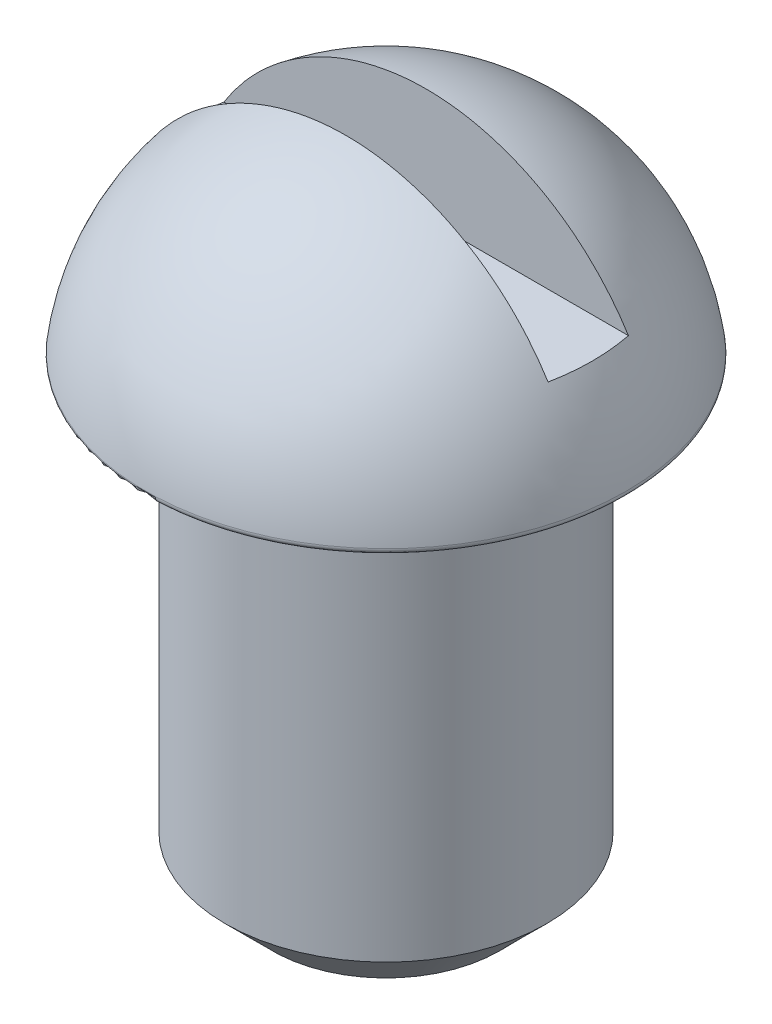
ISO-10303-21;
HEADER;
FILE_DESCRIPTION(('STEP AP214'),'2;1');
FILE_NAME('part.step','',(''),(''),'','','');
FILE_SCHEMA(('AUTOMOTIVE_DESIGN { 1 0 10303 214 1 1 1 1 }'));
ENDSEC;
DATA;
#1=APPLICATION_CONTEXT('core data for automotive mechanical design processes');
#2=APPLICATION_PROTOCOL_DEFINITION('international standard','automotive_design',2000,#1);
#3=PRODUCT_CONTEXT('',#1,'mechanical');
#4=PRODUCT('Part','Part','',(#3));
#5=PRODUCT_RELATED_PRODUCT_CATEGORY('part','',(#4));
#6=PRODUCT_DEFINITION_FORMATION('','',#4);
#7=PRODUCT_DEFINITION_CONTEXT('part definition',#1,'design');
#8=PRODUCT_DEFINITION('design','',#6,#7);
#9=PRODUCT_DEFINITION_SHAPE('','',#8);
#10=(LENGTH_UNIT() NAMED_UNIT(*) SI_UNIT(.MILLI.,.METRE.));
#11=(NAMED_UNIT(*) PLANE_ANGLE_UNIT() SI_UNIT($,.RADIAN.));
#12=(NAMED_UNIT(*) SI_UNIT($,.STERADIAN.) SOLID_ANGLE_UNIT());
#13=UNCERTAINTY_MEASURE_WITH_UNIT(LENGTH_MEASURE(1.E-05),#10,'distance_accuracy_value','');
#14=(GEOMETRIC_REPRESENTATION_CONTEXT(3) GLOBAL_UNCERTAINTY_ASSIGNED_CONTEXT((#13)) GLOBAL_UNIT_ASSIGNED_CONTEXT((#10,
#11,#12)) REPRESENTATION_CONTEXT('',''));
#15=CARTESIAN_POINT('',(0.,0.,0.));
#16=DIRECTION('',(0.,0.,1.));
#17=DIRECTION('',(1.,0.,0.));
#18=AXIS2_PLACEMENT_3D('',#15,#16,#17);
#19=CARTESIAN_POINT('',(0.,85.2820214748699,0.));
#20=DIRECTION('',(0.,1.,0.));
#21=DIRECTION('',(-1.,0.,0.));
#22=AXIS2_PLACEMENT_3D('',#19,#20,#21);
#23=DEGENERATE_TOROIDAL_SURFACE('',#22,0.0484444428070954,9.1,.F.);
#24=CARTESIAN_POINT('',(0.,86.4755444133753,0.));
#25=DIRECTION('',(0.,-1.,0.));
#26=DIRECTION('',(1.,0.,0.));
#27=AXIS2_PLACEMENT_3D('',#24,#25,#26);
#28=CIRCLE('',#27,8.97294696845876);
#29=CARTESIAN_POINT('',(8.97294696845875,86.4755444133753,0.));
#30=VERTEX_POINT('',#29);
#31=EDGE_CURVE('E109',#30,#30,#28,.F.);
#32=ORIENTED_EDGE('',*,*,#31,.T.);
#33=EDGE_LOOP('',(#32));
#34=FACE_BOUND('',#33,.T.);
#35=CARTESIAN_POINT('',(0.,90.0493131400015,0.));
#36=DIRECTION('',(0.,1.,0.));
#37=DIRECTION('',(0.,0.,1.));
#38=AXIS2_PLACEMENT_3D('',#35,#36,#37);
#39=CIRCLE('',#38,7.70287352122754);
#40=CARTESIAN_POINT('',(7.555412661399,90.0493131400015,1.5));
#41=VERTEX_POINT('',#40);
#42=CARTESIAN_POINT('',(7.555412661399,90.0493131400015,-1.5));
#43=VERTEX_POINT('',#42);
#44=EDGE_CURVE('E59',#41,#43,#39,.T.);
#45=ORIENTED_EDGE('',*,*,#44,.F.);
#46=CARTESIAN_POINT('',(0.,94.2493131400015,1.5));
#47=CARTESIAN_POINT('',(-0.253126286000892,94.2493147584084,1.5));
#48=CARTESIAN_POINT('',(-0.506239797947491,94.2382230550661,1.5));
#49=CARTESIAN_POINT('',(-1.01053156617786,94.1941887869828,1.5));
#50=CARTESIAN_POINT('',(-1.26171000869937,94.1612483523017,1.5));
#51=CARTESIAN_POINT('',(-1.75779628974337,94.0744780129281,1.5));
#52=CARTESIAN_POINT('',(-2.0027418927103,94.0208634352023,1.5));
#53=CARTESIAN_POINT('',(-2.48734232888324,93.8932037480559,1.5));
#54=CARTESIAN_POINT('',(-2.72699524952156,93.8191513795855,1.5));
#55=CARTESIAN_POINT('',(-3.19958344197064,93.6510764324646,1.5));
#56=CARTESIAN_POINT('',(-3.43250846779259,93.5570250486329,1.5));
#57=CARTESIAN_POINT('',(-3.88964612829137,93.3497019205855,1.5));
#58=CARTESIAN_POINT('',(-4.11385860041981,93.2364298179841,1.5));
#59=CARTESIAN_POINT('',(-4.55228637520147,92.9913120123662,1.5));
#60=CARTESIAN_POINT('',(-4.76648781822825,92.8594415192794,1.5));
#61=CARTESIAN_POINT('',(-5.18306604276846,92.5781770699538,1.5));
#62=CARTESIAN_POINT('',(-5.38544254899095,92.4287827059931,1.5));
#63=CARTESIAN_POINT('',(-5.77683207995016,92.113617752993,1.5));
#64=CARTESIAN_POINT('',(-5.96585234812945,91.947856159113,1.5));
#65=CARTESIAN_POINT('',(-6.32938279182137,91.6009996747844,1.5));
#66=CARTESIAN_POINT('',(-6.50388792222596,91.4198994967939,1.5));
#67=CARTESIAN_POINT('',(-6.83767545333952,91.0430277660081,1.5));
#68=CARTESIAN_POINT('',(-6.99690179921901,90.8472065626681,1.5));
#69=CARTESIAN_POINT('',(-7.29830176686525,90.4428483493586,1.5));
#70=CARTESIAN_POINT('',(-7.44047509577037,90.234311121102,1.5));
#71=CARTESIAN_POINT('',(-7.70676482887685,89.805992817466,1.5));
#72=CARTESIAN_POINT('',(-7.83088016138328,89.5862110757996,1.5));
#73=CARTESIAN_POINT('',(-8.0601651632223,89.1369719279644,1.5));
#74=CARTESIAN_POINT('',(-8.16533442308827,88.9075143128108,1.5));
#75=CARTESIAN_POINT('',(-8.35599434334159,88.4405163920357,1.5));
#76=CARTESIAN_POINT('',(-8.44148149285895,88.202974653039,1.5));
#77=CARTESIAN_POINT('',(-8.59217213345419,87.721451811669,1.5));
#78=CARTESIAN_POINT('',(-8.65736858514219,87.4774685063175,1.5));
#79=CARTESIAN_POINT('',(-8.76696416438945,86.9849219070482,1.5));
#80=CARTESIAN_POINT('',(-8.81136711221042,86.7363594631559,1.5));
#81=CARTESIAN_POINT('',(-8.87907800268428,86.2363774056246,1.5));
#82=CARTESIAN_POINT('',(-8.90238591768649,85.9849577882409,1.5));
#83=CARTESIAN_POINT('',(-8.92774204044019,85.4810288473107,1.5));
#84=CARTESIAN_POINT('',(-8.92978856712383,85.2285194391769,1.5));
#85=CARTESIAN_POINT('',(-8.91260276802194,84.72421883529,1.5));
#86=CARTESIAN_POINT('',(-8.89336985759334,84.4724276594607,1.5));
#87=CARTESIAN_POINT('',(-8.83376082500649,83.9713597519565,1.5));
#88=CARTESIAN_POINT('',(-8.7933846336998,83.7220830285079,1.5));
#89=CARTESIAN_POINT('',(-8.69177731884776,83.2278238992692,1.5));
#90=CARTESIAN_POINT('',(-8.63054676692235,82.9828413759681,1.5));
#91=CARTESIAN_POINT('',(-8.48766363074804,82.4988987489693,1.5));
#92=CARTESIAN_POINT('',(-8.40601049346716,82.2599388085525,1.5));
#93=CARTESIAN_POINT('',(-8.22286338640708,81.7897476197453,1.5));
#94=CARTESIAN_POINT('',(-8.12136944257431,81.5585163612482,1.5));
#95=CARTESIAN_POINT('',(-7.89924332215015,81.1053886367319,1.5));
#96=CARTESIAN_POINT('',(-7.77860796094373,80.8834937318157,1.5));
#97=CARTESIAN_POINT('',(-7.51911368947463,80.4507332794758,1.5));
#98=CARTESIAN_POINT('',(-7.38026110771471,80.2398639372828,1.5));
#99=CARTESIAN_POINT('',(-7.08526643753657,79.8305437482489,1.5));
#100=CARTESIAN_POINT('',(-6.92912202534685,79.6320945761211,1.5));
#101=CARTESIAN_POINT('',(-6.60067215441629,79.2490621046702,1.5));
#102=CARTESIAN_POINT('',(-6.42836707588407,79.0644784793191,1.5));
#103=CARTESIAN_POINT('',(-6.06881176708733,78.7104808605171,1.5));
#104=CARTESIAN_POINT('',(-5.88156111937584,78.5410672910641,1.5));
#105=CARTESIAN_POINT('',(-5.49345219243313,78.2186252818443,1.5));
#106=CARTESIAN_POINT('',(-5.29259413258583,78.065596578017,1.5));
#107=CARTESIAN_POINT('',(-4.87870508402365,77.77702085446,1.5));
#108=CARTESIAN_POINT('',(-4.66567472990684,77.6414729245744,1.5));
#109=CARTESIAN_POINT('',(-4.22902536669204,77.3888669372677,1.5));
#110=CARTESIAN_POINT('',(-4.00541031394046,77.2718020410988,1.5));
#111=CARTESIAN_POINT('',(-3.54904618870066,77.0569180273546,1.5));
#112=CARTESIAN_POINT('',(-3.31629479204677,76.9591038454653,1.5));
#113=CARTESIAN_POINT('',(-2.84335871664583,76.7834755195159,1.5));
#114=CARTESIAN_POINT('',(-2.60317389747381,76.7056617535429,1.5));
#115=CARTESIAN_POINT('',(-2.11731034774447,76.5707029511665,1.5));
#116=CARTESIAN_POINT('',(-1.87163705721269,76.5135383357546,1.5));
#117=CARTESIAN_POINT('',(-1.37632314360723,76.4202865837127,1.5));
#118=CARTESIAN_POINT('',(-1.12668260809043,76.384198982576,1.5));
#119=CARTESIAN_POINT('',(-0.625279946721241,76.3336108528795,1.5));
#120=CARTESIAN_POINT('',(-0.37351838828146,76.3191047244346,1.5));
#121=CARTESIAN_POINT('',(0.130308789582986,76.3120572213891,1.5));
#122=CARTESIAN_POINT('',(0.382374400592746,76.3195152522488,1.5));
#123=CARTESIAN_POINT('',(0.880193058063184,76.355820738571,1.5));
#124=CARTESIAN_POINT('',(1.12597582062862,76.3842643295761,1.5));
#125=CARTESIAN_POINT('',(1.61430623343127,76.4615924922849,1.5));
#126=CARTESIAN_POINT('',(1.85685379826309,76.5104776025227,1.5));
#127=CARTESIAN_POINT('',(2.337113652077,76.6282378915395,1.5));
#128=CARTESIAN_POINT('',(2.57482461934085,76.6971184580916,1.5));
#129=CARTESIAN_POINT('',(3.04371937841491,76.8543307356359,1.5));
#130=CARTESIAN_POINT('',(3.27490326197323,76.9426621730626,1.5));
#131=CARTESIAN_POINT('',(3.73162277345527,77.1392000179846,1.5));
#132=CARTESIAN_POINT('',(3.95707063824226,77.2476104287428,1.5));
#133=CARTESIAN_POINT('',(4.3982008895612,77.4829306336545,1.5));
#134=CARTESIAN_POINT('',(4.61387965832145,77.6098472089269,1.5));
#135=CARTESIAN_POINT('',(5.03381428513797,77.8812130744994,1.5));
#136=CARTESIAN_POINT('',(5.23807369705332,78.0256568652222,1.5));
#137=CARTESIAN_POINT('',(5.63382166983986,78.3310979364636,1.5));
#138=CARTESIAN_POINT('',(5.82530998310113,78.4920955377787,1.5));
#139=CARTESIAN_POINT('',(6.1957347380034,78.8309411930151,1.5));
#140=CARTESIAN_POINT('',(6.37455159586909,79.008920001311,1.5));
#141=CARTESIAN_POINT('',(6.71657236025573,79.3793043085305,1.5));
#142=CARTESIAN_POINT('',(6.87977580325888,79.5717102354518,1.5));
#143=CARTESIAN_POINT('',(7.18938961811549,79.969555622385,1.5));
#144=CARTESIAN_POINT('',(7.33580184758958,80.1749936367372,1.5));
#145=CARTESIAN_POINT('',(7.61086340476026,80.5975369595277,1.5));
#146=CARTESIAN_POINT('',(7.73950655833195,80.8146462871153,1.5));
#147=CARTESIAN_POINT('',(7.97811476805929,81.259032481617,1.5));
#148=CARTESIAN_POINT('',(8.08807075860098,81.486314216261,1.5));
#149=CARTESIAN_POINT('',(8.28844979128575,81.9493366296918,1.5));
#150=CARTESIAN_POINT('',(8.3788724183493,82.1850774881089,1.5));
#151=CARTESIAN_POINT('',(8.53953605434811,82.6633278561975,1.5));
#152=CARTESIAN_POINT('',(8.60977790926667,82.9058370816695,1.5));
#153=CARTESIAN_POINT('',(8.72958735360661,83.3959151803932,1.5));
#154=CARTESIAN_POINT('',(8.77915451173507,83.643484159083,1.5));
#155=CARTESIAN_POINT('',(8.85726568176,84.1419514880077,1.5));
#156=CARTESIAN_POINT('',(8.88580681453034,84.3928502894137,1.5));
#157=CARTESIAN_POINT('',(8.92165201319401,84.8961603771749,1.5));
#158=CARTESIAN_POINT('',(8.92895607771604,85.1485716636278,1.5));
#159=CARTESIAN_POINT('',(8.92227518547556,85.6531161497072,1.5));
#160=CARTESIAN_POINT('',(8.90828990798377,85.9052493450871,1.5));
#161=CARTESIAN_POINT('',(8.85912963685118,86.4074361105604,1.5));
#162=CARTESIAN_POINT('',(8.82395508654758,86.6574897240534,1.5));
#163=CARTESIAN_POINT('',(8.73266497920622,87.1537537415015,1.5));
#164=CARTESIAN_POINT('',(8.67654869038963,87.3999640108433,1.5));
#165=CARTESIAN_POINT('',(8.54377541474271,87.886776779083,1.5));
#166=CARTESIAN_POINT('',(8.46711885819499,88.1273793953366,1.5));
#167=CARTESIAN_POINT('',(8.29379103479565,88.6013212640006,1.5));
#168=CARTESIAN_POINT('',(8.19711558242708,88.8346589857242,1.5));
#169=CARTESIAN_POINT('',(7.98448385475258,89.2922792318004,1.5));
#170=CARTESIAN_POINT('',(7.86853426441638,89.5165648623429,1.5));
#171=CARTESIAN_POINT('',(7.61812553398023,89.9546225479832,1.5));
#172=CARTESIAN_POINT('',(7.48366213244255,90.1683921671258,1.5));
#173=CARTESIAN_POINT('',(7.19720487809234,90.5838371322688,1.5));
#174=CARTESIAN_POINT('',(7.04521140855555,90.7855127425449,1.5));
#175=CARTESIAN_POINT('',(6.72479675918272,91.1753093235742,1.5));
#176=CARTESIAN_POINT('',(6.55637814810753,91.3634324058586,1.5));
#177=CARTESIAN_POINT('',(6.20429252451751,91.724816955788,1.5));
#178=CARTESIAN_POINT('',(6.02062575567433,91.8980786608338,1.5));
#179=CARTESIAN_POINT('',(5.63940331432423,92.2284601174589,1.5));
#180=CARTESIAN_POINT('',(5.44185184138895,92.3855847147849,1.5));
#181=CARTESIAN_POINT('',(5.03428351401001,92.6825804589461,1.5));
#182=CARTESIAN_POINT('',(4.82427094214995,92.8224574830713,1.5));
#183=CARTESIAN_POINT('',(4.39298629491286,93.0841555867799,1.5));
#184=CARTESIAN_POINT('',(4.17170295895762,93.2059581132855,1.5));
#185=CARTESIAN_POINT('',(3.71964464380099,93.4304619076131,1.5));
#186=CARTESIAN_POINT('',(3.48886922823869,93.5331622960885,1.5));
#187=CARTESIAN_POINT('',(2.99560575533823,93.7281363020401,1.5));
#188=CARTESIAN_POINT('',(2.73227728228447,93.8182916751928,1.5));
#189=CARTESIAN_POINT('',(2.19836471618549,93.9736639898798,1.5));
#190=CARTESIAN_POINT('',(1.92778051845821,94.0388805714022,1.5));
#191=CARTESIAN_POINT('',(1.3821745433772,94.1435949892502,1.5));
#192=CARTESIAN_POINT('',(1.10716153976396,94.1831384810188,1.5));
#193=CARTESIAN_POINT('',(0.554759633465017,94.2359893297277,1.5));
#194=CARTESIAN_POINT('',(0.277372147534231,94.2493113665745,1.5));
#195=CARTESIAN_POINT('',(0.,94.2493131400015,1.5));
#196=B_SPLINE_CURVE_WITH_KNOTS('',3,(#46,#47,#48,#49,#50,#51,#52,#53,#54,#55,#56,#57,#58,#59,
#60,#61,#62,#63,#64,#65,#66,#67,#68,#69,#70,#71,#72,#73,#74,#75,#76,#77,#78,#79,#80,#81,#82,#83,
#84,#85,#86,#87,#88,#89,#90,#91,#92,#93,#94,#95,#96,#97,#98,#99,#100,#101,#102,#103,#104,#105,
#106,#107,#108,#109,#110,#111,#112,#113,#114,#115,#116,#117,#118,#119,#120,#121,#122,#123,#124,
#125,#126,#127,#128,#129,#130,#131,#132,#133,#134,#135,#136,#137,#138,#139,#140,#141,#142,#143,
#144,#145,#146,#147,#148,#149,#150,#151,#152,#153,#154,#155,#156,#157,#158,#159,#160,#161,#162,
#163,#164,#165,#166,#167,#168,#169,#170,#171,#172,#173,#174,#175,#176,#177,#178,#179,#180,#181,
#182,#183,#184,#185,#186,#187,#188,#189,#190,#191,#192,#193,#194,#195),.UNSPECIFIED.,.T.,.F.,(4,
2,2,2,2,2,2,2,2,2,2,2,2,2,2,2,2,2,2,2,2,2,2,2,2,2,2,2,2,2,2,2,2,2,2,2,2,2,2,2,2,2,2,2,2,2,2,2,2,
2,2,2,2,2,2,2,2,2,2,2,2,2,2,2,2,2,2,2,2,2,2,2,2,2,4),(0.,0.759120308470634,1.51816662023554,
2.26951194837326,3.0211244818922,3.77382700849304,4.52654357138102,5.28027309386196,
6.03402015658892,6.7873552539812,7.54095110756811,8.29721375353569,9.05348938539379,
9.80980988194432,10.5661467222973,11.3226183727134,12.0793521717353,12.8359468861443,
13.5925425922716,14.3491981194708,15.1058744359607,15.8625532271527,16.6192112793784,
17.3758898236925,18.132567378482,18.8893709562426,19.645912319783,20.4025554751791,
21.1591808336529,21.9158273329454,22.6724616361944,23.4290565285212,24.1853708203337,
24.941878771491,25.6984010225934,26.4542040635511,27.2099904470789,27.9655806875696,
28.7211504754512,29.4625466775353,30.2039624130197,30.9455781086087,31.6871833744621,
32.4367838029188,33.1866595970903,33.9363007055249,34.685956344005,35.4419393409428,
36.1979447739023,36.9538664887448,37.7100502024317,38.4665997191865,39.2231653108649,
39.9796991824848,40.7362488352983,41.4929020643788,42.2495553423166,43.0062200195385,
43.762868865828,44.5195441545956,45.2762035935819,46.0330213936698,46.7895772475144,
47.5463075344987,48.3030212795389,49.0596168697972,49.8162003716823,50.5725560137824,
51.328653203346,52.085521219844,52.8424240693355,53.6761980961636,54.5099841587551,
55.3422833763413,56.1741165040814),.UNSPECIFIED.);
#197=CARTESIAN_POINT('',(-7.55541266139901,90.0493131400015,1.5));
#198=VERTEX_POINT('',#197);
#199=EDGE_CURVE('E57',#41,#198,#196,.T.);
#200=ORIENTED_EDGE('',*,*,#199,.T.);
#201=CARTESIAN_POINT('',(-7.55541266139901,90.0493131400015,-1.5));
#202=VERTEX_POINT('',#201);
#203=EDGE_CURVE('E58',#202,#198,#39,.T.);
#204=ORIENTED_EDGE('',*,*,#203,.F.);
#205=CARTESIAN_POINT('',(0.,94.2493131400015,-1.5));
#206=CARTESIAN_POINT('',(0.25312628600088,94.2493147584084,-1.5));
#207=CARTESIAN_POINT('',(0.506239797947479,94.2382230550661,-1.5));
#208=CARTESIAN_POINT('',(1.01053156617785,94.1941887869828,-1.5));
#209=CARTESIAN_POINT('',(1.26171000869936,94.1612483523017,-1.5));
#210=CARTESIAN_POINT('',(1.75779628974336,94.0744780129281,-1.5));
#211=CARTESIAN_POINT('',(2.00274189271029,94.0208634352023,-1.5));
#212=CARTESIAN_POINT('',(2.48734232888323,93.8932037480559,-1.5));
#213=CARTESIAN_POINT('',(2.72699524952154,93.8191513795855,-1.5));
#214=CARTESIAN_POINT('',(3.19958344197063,93.6510764324646,-1.5));
#215=CARTESIAN_POINT('',(3.43250846779258,93.5570250486329,-1.5));
#216=CARTESIAN_POINT('',(3.88964612829136,93.3497019205855,-1.5));
#217=CARTESIAN_POINT('',(4.1138586004198,93.2364298179841,-1.5));
#218=CARTESIAN_POINT('',(4.55228637520146,92.9913120123662,-1.5));
#219=CARTESIAN_POINT('',(4.76648781822824,92.8594415192794,-1.5));
#220=CARTESIAN_POINT('',(5.18306604276845,92.5781770699538,-1.5));
#221=CARTESIAN_POINT('',(5.38544254899094,92.4287827059931,-1.5));
#222=CARTESIAN_POINT('',(5.77683207995015,92.113617752993,-1.5));
#223=CARTESIAN_POINT('',(5.96585234812944,91.947856159113,-1.5));
#224=CARTESIAN_POINT('',(6.32938279182136,91.6009996747844,-1.5));
#225=CARTESIAN_POINT('',(6.50388792222595,91.4198994967939,-1.5));
#226=CARTESIAN_POINT('',(6.83767545333951,91.0430277660081,-1.5));
#227=CARTESIAN_POINT('',(6.996901799219,90.8472065626681,-1.5));
#228=CARTESIAN_POINT('',(7.29830176686524,90.4428483493586,-1.5));
#229=CARTESIAN_POINT('',(7.44047509577036,90.234311121102,-1.5));
#230=CARTESIAN_POINT('',(7.70676482887684,89.805992817466,-1.5));
#231=CARTESIAN_POINT('',(7.83088016138326,89.5862110757996,-1.5));
#232=CARTESIAN_POINT('',(8.06016516322229,89.1369719279644,-1.5));
#233=CARTESIAN_POINT('',(8.16533442308826,88.9075143128108,-1.5));
#234=CARTESIAN_POINT('',(8.35599434334158,88.4405163920357,-1.5));
#235=CARTESIAN_POINT('',(8.44148149285894,88.202974653039,-1.5));
#236=CARTESIAN_POINT('',(8.59217213345418,87.721451811669,-1.5));
#237=CARTESIAN_POINT('',(8.65736858514217,87.4774685063175,-1.5));
#238=CARTESIAN_POINT('',(8.76696416438944,86.9849219070482,-1.5));
#239=CARTESIAN_POINT('',(8.81136711221041,86.7363594631559,-1.5));
#240=CARTESIAN_POINT('',(8.87907800268427,86.2363774056246,-1.5));
#241=CARTESIAN_POINT('',(8.90238591768648,85.9849577882409,-1.5));
#242=CARTESIAN_POINT('',(8.92774204044018,85.4810288473107,-1.5));
#243=CARTESIAN_POINT('',(8.92978856712382,85.2285194391769,-1.5));
#244=CARTESIAN_POINT('',(8.91260276802193,84.72421883529,-1.5));
#245=CARTESIAN_POINT('',(8.89336985759332,84.4724276594607,-1.5));
#246=CARTESIAN_POINT('',(8.83376082500648,83.9713597519565,-1.5));
#247=CARTESIAN_POINT('',(8.79338463369978,83.7220830285079,-1.5));
#248=CARTESIAN_POINT('',(8.69177731884774,83.2278238992691,-1.5));
#249=CARTESIAN_POINT('',(8.63054676692233,82.9828413759681,-1.5));
#250=CARTESIAN_POINT('',(8.48766363074803,82.4988987489692,-1.5));
#251=CARTESIAN_POINT('',(8.40601049346714,82.2599388085525,-1.5));
#252=CARTESIAN_POINT('',(8.22286338640706,81.7897476197453,-1.5));
#253=CARTESIAN_POINT('',(8.12136944257429,81.5585163612482,-1.5));
#254=CARTESIAN_POINT('',(7.89924332215013,81.1053886367319,-1.5));
#255=CARTESIAN_POINT('',(7.77860796094372,80.8834937318157,-1.5));
#256=CARTESIAN_POINT('',(7.51911368947462,80.4507332794759,-1.5));
#257=CARTESIAN_POINT('',(7.3802611077147,80.2398639372828,-1.5));
#258=CARTESIAN_POINT('',(7.08526643753655,79.8305437482489,-1.5));
#259=CARTESIAN_POINT('',(6.92912202534684,79.6320945761211,-1.5));
#260=CARTESIAN_POINT('',(6.60067215441628,79.2490621046702,-1.5));
#261=CARTESIAN_POINT('',(6.42836707588406,79.0644784793191,-1.5));
#262=CARTESIAN_POINT('',(6.06881176708732,78.7104808605171,-1.5));
#263=CARTESIAN_POINT('',(5.88156111937583,78.5410672910641,-1.5));
#264=CARTESIAN_POINT('',(5.49345219243312,78.2186252818443,-1.5));
#265=CARTESIAN_POINT('',(5.29259413258582,78.065596578017,-1.5));
#266=CARTESIAN_POINT('',(4.87870508402364,77.77702085446,-1.5));
#267=CARTESIAN_POINT('',(4.66567472990683,77.6414729245744,-1.5));
#268=CARTESIAN_POINT('',(4.22902536669203,77.3888669372677,-1.5));
#269=CARTESIAN_POINT('',(4.00541031394045,77.2718020410988,-1.5));
#270=CARTESIAN_POINT('',(3.54904618870064,77.0569180273546,-1.5));
#271=CARTESIAN_POINT('',(3.31629479204675,76.9591038454653,-1.5));
#272=CARTESIAN_POINT('',(2.84335871664582,76.7834755195159,-1.5));
#273=CARTESIAN_POINT('',(2.6031738974738,76.7056617535429,-1.5));
#274=CARTESIAN_POINT('',(2.11731034774446,76.5707029511665,-1.5));
#275=CARTESIAN_POINT('',(1.87163705721268,76.5135383357546,-1.5));
#276=CARTESIAN_POINT('',(1.37632314360722,76.4202865837127,-1.5));
#277=CARTESIAN_POINT('',(1.12668260809042,76.384198982576,-1.5));
#278=CARTESIAN_POINT('',(0.625279946721229,76.3336108528795,-1.5));
#279=CARTESIAN_POINT('',(0.373518388281448,76.3191047244346,-1.5));
#280=CARTESIAN_POINT('',(-0.130308789582998,76.3120572213891,-1.5));
#281=CARTESIAN_POINT('',(-0.382374400592758,76.3195152522488,-1.5));
#282=CARTESIAN_POINT('',(-0.880193058063197,76.355820738571,-1.5));
#283=CARTESIAN_POINT('',(-1.12597582062863,76.3842643295761,-1.5));
#284=CARTESIAN_POINT('',(-1.61430623343128,76.4615924922849,-1.5));
#285=CARTESIAN_POINT('',(-1.85685379826311,76.5104776025227,-1.5));
#286=CARTESIAN_POINT('',(-2.33711365207701,76.6282378915395,-1.5));
#287=CARTESIAN_POINT('',(-2.57482461934087,76.6971184580916,-1.5));
#288=CARTESIAN_POINT('',(-3.04371937841492,76.8543307356359,-1.5));
#289=CARTESIAN_POINT('',(-3.27490326197325,76.9426621730626,-1.5));
#290=CARTESIAN_POINT('',(-3.73162277345528,77.1392000179846,-1.5));
#291=CARTESIAN_POINT('',(-3.95707063824227,77.2476104287428,-1.5));
#292=CARTESIAN_POINT('',(-4.39820088956121,77.4829306336545,-1.5));
#293=CARTESIAN_POINT('',(-4.61387965832146,77.6098472089269,-1.5));
#294=CARTESIAN_POINT('',(-5.03381428513799,77.8812130744994,-1.5));
#295=CARTESIAN_POINT('',(-5.23807369705333,78.0256568652222,-1.5));
#296=CARTESIAN_POINT('',(-5.63382166983987,78.3310979364636,-1.5));
#297=CARTESIAN_POINT('',(-5.82530998310115,78.4920955377787,-1.5));
#298=CARTESIAN_POINT('',(-6.19573473800341,78.8309411930151,-1.5));
#299=CARTESIAN_POINT('',(-6.3745515958691,79.008920001311,-1.5));
#300=CARTESIAN_POINT('',(-6.71657236025574,79.3793043085305,-1.5));
#301=CARTESIAN_POINT('',(-6.87977580325889,79.5717102354518,-1.5));
#302=CARTESIAN_POINT('',(-7.18938961811551,79.969555622385,-1.5));
#303=CARTESIAN_POINT('',(-7.3358018475896,80.1749936367372,-1.5));
#304=CARTESIAN_POINT('',(-7.61086340476027,80.5975369595277,-1.5));
#305=CARTESIAN_POINT('',(-7.73950655833196,80.8146462871153,-1.5));
#306=CARTESIAN_POINT('',(-7.9781147680593,81.259032481617,-1.5));
#307=CARTESIAN_POINT('',(-8.088070758601,81.486314216261,-1.5));
#308=CARTESIAN_POINT('',(-8.28844979128577,81.9493366296918,-1.5));
#309=CARTESIAN_POINT('',(-8.37887241834932,82.1850774881089,-1.5));
#310=CARTESIAN_POINT('',(-8.53953605434813,82.6633278561975,-1.5));
#311=CARTESIAN_POINT('',(-8.60977790926668,82.9058370816695,-1.5));
#312=CARTESIAN_POINT('',(-8.72958735360663,83.3959151803932,-1.5));
#313=CARTESIAN_POINT('',(-8.77915451173508,83.643484159083,-1.5));
#314=CARTESIAN_POINT('',(-8.85726568176001,84.1419514880077,-1.5));
#315=CARTESIAN_POINT('',(-8.88580681453035,84.3928502894137,-1.5));
#316=CARTESIAN_POINT('',(-8.92165201319402,84.8961603771749,-1.5));
#317=CARTESIAN_POINT('',(-8.92895607771606,85.1485716636278,-1.5));
#318=CARTESIAN_POINT('',(-8.92227518547558,85.6531161497072,-1.5));
#319=CARTESIAN_POINT('',(-8.90828990798378,85.9052493450871,-1.5));
#320=CARTESIAN_POINT('',(-8.8591296368512,86.4074361105604,-1.5));
#321=CARTESIAN_POINT('',(-8.8239550865476,86.6574897240533,-1.5));
#322=CARTESIAN_POINT('',(-8.73266497920624,87.1537537415015,-1.5));
#323=CARTESIAN_POINT('',(-8.67654869038964,87.3999640108433,-1.5));
#324=CARTESIAN_POINT('',(-8.54377541474273,87.886776779083,-1.5));
#325=CARTESIAN_POINT('',(-8.467118858195,88.1273793953366,-1.5));
#326=CARTESIAN_POINT('',(-8.29379103479566,88.6013212640006,-1.5));
#327=CARTESIAN_POINT('',(-8.19711558242708,88.8346589857242,-1.5));
#328=CARTESIAN_POINT('',(-7.98448385475258,89.2922792318004,-1.5));
#329=CARTESIAN_POINT('',(-7.86853426441638,89.5165648623429,-1.5));
#330=CARTESIAN_POINT('',(-7.61812553398024,89.9546225479832,-1.5));
#331=CARTESIAN_POINT('',(-7.48366213244256,90.1683921671258,-1.5));
#332=CARTESIAN_POINT('',(-7.19720487809235,90.5838371322688,-1.5));
#333=CARTESIAN_POINT('',(-7.04521140855555,90.785512742545,-1.5));
#334=CARTESIAN_POINT('',(-6.72479675918272,91.1753093235742,-1.5));
#335=CARTESIAN_POINT('',(-6.55637814810754,91.3634324058586,-1.5));
#336=CARTESIAN_POINT('',(-6.20429252451752,91.724816955788,-1.5));
#337=CARTESIAN_POINT('',(-6.02062575567434,91.8980786608338,-1.5));
#338=CARTESIAN_POINT('',(-5.63940331432424,92.2284601174589,-1.5));
#339=CARTESIAN_POINT('',(-5.44185184138896,92.3855847147849,-1.5));
#340=CARTESIAN_POINT('',(-5.03428351401002,92.6825804589461,-1.5));
#341=CARTESIAN_POINT('',(-4.82427094214996,92.8224574830713,-1.5));
#342=CARTESIAN_POINT('',(-4.39298629491287,93.0841555867798,-1.5));
#343=CARTESIAN_POINT('',(-4.17170295895763,93.2059581132855,-1.5));
#344=CARTESIAN_POINT('',(-3.719644643801,93.4304619076131,-1.5));
#345=CARTESIAN_POINT('',(-3.4888692282387,93.5331622960885,-1.5));
#346=CARTESIAN_POINT('',(-2.99560575533824,93.7281363020401,-1.5));
#347=CARTESIAN_POINT('',(-2.73227728228449,93.8182916751928,-1.5));
#348=CARTESIAN_POINT('',(-2.19836471618551,93.9736639898798,-1.5));
#349=CARTESIAN_POINT('',(-1.92778051845823,94.0388805714022,-1.5));
#350=CARTESIAN_POINT('',(-1.38217454337721,94.1435949892502,-1.5));
#351=CARTESIAN_POINT('',(-1.10716153976398,94.1831384810188,-1.5));
#352=CARTESIAN_POINT('',(-0.554759633465029,94.2359893297277,-1.5));
#353=CARTESIAN_POINT('',(-0.277372147534243,94.2493113665745,-1.5));
#354=CARTESIAN_POINT('',(0.,94.2493131400015,-1.5));
#355=B_SPLINE_CURVE_WITH_KNOTS('',3,(#205,#206,#207,#208,#209,#210,#211,#212,#213,#214,#215,
#216,#217,#218,#219,#220,#221,#222,#223,#224,#225,#226,#227,#228,#229,#230,#231,#232,#233,#234,
#235,#236,#237,#238,#239,#240,#241,#242,#243,#244,#245,#246,#247,#248,#249,#250,#251,#252,#253,
#254,#255,#256,#257,#258,#259,#260,#261,#262,#263,#264,#265,#266,#267,#268,#269,#270,#271,#272,
#273,#274,#275,#276,#277,#278,#279,#280,#281,#282,#283,#284,#285,#286,#287,#288,#289,#290,#291,
#292,#293,#294,#295,#296,#297,#298,#299,#300,#301,#302,#303,#304,#305,#306,#307,#308,#309,#310,
#311,#312,#313,#314,#315,#316,#317,#318,#319,#320,#321,#322,#323,#324,#325,#326,#327,#328,#329,
#330,#331,#332,#333,#334,#335,#336,#337,#338,#339,#340,#341,#342,#343,#344,#345,#346,#347,#348,
#349,#350,#351,#352,#353,#354),.UNSPECIFIED.,.T.,.F.,(4,2,2,2,2,2,2,2,2,2,2,2,2,2,2,2,2,2,2,2,2,
2,2,2,2,2,2,2,2,2,2,2,2,2,2,2,2,2,2,2,2,2,2,2,2,2,2,2,2,2,2,2,2,2,2,2,2,2,2,2,2,2,2,2,2,2,2,2,2,
2,2,2,2,2,4),(0.,0.759120308470634,1.51816662023554,2.26951194837326,3.0211244818922,
3.77382700849304,4.52654357138102,5.28027309386196,6.03402015658892,6.7873552539812,
7.54095110756811,8.2972137535357,9.05348938539379,9.80980988194432,10.5661467222973,
11.3226183727134,12.0793521717353,12.8359468861443,13.5925425922716,14.3491981194708,
15.1058744359607,15.8625532271527,16.6192112793784,17.3758898236925,18.132567378482,
18.8893709562426,19.645912319783,20.4025554751791,21.1591808336529,21.9158273329454,
22.6724616361944,23.4290565285212,24.1853708203337,24.941878771491,25.6984010225934,
26.4542040635511,27.2099904470789,27.9655806875696,28.7211504754512,29.4625466775353,
30.2039624130197,30.9455781086087,31.6871833744621,32.4367838029188,33.1866595970903,
33.9363007055249,34.685956344005,35.4419393409428,36.1979447739023,36.9538664887448,
37.7100502024317,38.4665997191865,39.2231653108649,39.9796991824848,40.7362488352983,
41.4929020643788,42.2495553423166,43.0062200195385,43.762868865828,44.5195441545956,
45.2762035935819,46.0330213936698,46.7895772475144,47.5463075344986,48.3030212795389,
49.0596168697972,49.8162003716823,50.5725560137824,51.328653203346,52.085521219844,
52.8424240693355,53.6761980961636,54.5099841587551,55.3422833763413,56.1741165040814),.UNSPECIFIED.);
#356=EDGE_CURVE('E51',#202,#43,#355,.T.);
#357=ORIENTED_EDGE('',*,*,#356,.T.);
#358=EDGE_LOOP('',(#45,#200,#204,#357));
#359=FACE_BOUND('',#358,.T.);
#360=ADVANCED_FACE('F29',(#34,#359),#23,.F.);
#361=CARTESIAN_POINT('',(6.00000000000001,86.2493131400015,0.));
#362=DIRECTION('',(0.,1.,0.));
#363=DIRECTION('',(-1.,0.,0.));
#364=AXIS2_PLACEMENT_3D('',#361,#362,#363);
#365=PLANE('',#364);
#366=CARTESIAN_POINT('',(0.,86.2493131400015,0.));
#367=DIRECTION('',(0.,1.,0.));
#368=DIRECTION('',(-1.,0.,0.));
#369=AXIS2_PLACEMENT_3D('',#366,#367,#368);
#370=CIRCLE('',#369,8.77467462974962);
#371=CARTESIAN_POINT('',(-8.77467462974963,86.2493131400015,0.));
#372=VERTEX_POINT('',#371);
#373=EDGE_CURVE('E104',#372,#372,#370,.F.);
#374=ORIENTED_EDGE('',*,*,#373,.T.);
#375=EDGE_LOOP('',(#374));
#376=FACE_BOUND('',#375,.T.);
#377=CARTESIAN_POINT('',(0.,86.2493131400015,0.));
#378=DIRECTION('',(0.,1.,0.));
#379=DIRECTION('',(-1.,0.,0.));
#380=AXIS2_PLACEMENT_3D('',#377,#378,#379);
#381=CIRCLE('',#380,6.00000000000001);
#382=CARTESIAN_POINT('',(-6.00000000000002,86.2493131400015,0.));
#383=VERTEX_POINT('',#382);
#384=EDGE_CURVE('E66',#383,#383,#381,.T.);
#385=ORIENTED_EDGE('',*,*,#384,.T.);
#386=EDGE_LOOP('',(#385));
#387=FACE_BOUND('',#386,.T.);
#388=ADVANCED_FACE('F92',(#376,#387),#365,.F.);
#389=CARTESIAN_POINT('',(0.,125.763182897862,0.));
#390=DIRECTION('',(0.,1.,0.));
#391=DIRECTION('',(-1.,0.,0.));
#392=AXIS2_PLACEMENT_3D('',#389,#390,#391);
#393=CYLINDRICAL_SURFACE('',#392,6.00000000000001);
#394=CARTESIAN_POINT('',(0.,70.9993131400015,0.));
#395=DIRECTION('',(0.,1.,0.));
#396=DIRECTION('',(-1.,0.,0.));
#397=AXIS2_PLACEMENT_3D('',#394,#395,#396);
#398=CIRCLE('',#397,6.00000000000001);
#399=CARTESIAN_POINT('',(-6.00000000000001,70.9993131400015,0.));
#400=VERTEX_POINT('',#399);
#401=EDGE_CURVE('E37',#400,#400,#398,.T.);
#402=ORIENTED_EDGE('',*,*,#401,.T.);
#403=EDGE_LOOP('',(#402));
#404=FACE_BOUND('',#403,.T.);
#405=ORIENTED_EDGE('',*,*,#384,.F.);
#406=EDGE_LOOP('',(#405));
#407=FACE_BOUND('',#406,.T.);
#408=ADVANCED_FACE('F89',(#404,#407),#393,.T.);
#409=CARTESIAN_POINT('',(6.00000000000001,69.2493131400015,0.));
#410=DIRECTION('',(0.,1.,0.));
#411=DIRECTION('',(-1.,0.,0.));
#412=AXIS2_PLACEMENT_3D('',#409,#410,#411);
#413=PLANE('',#412);
#414=CARTESIAN_POINT('',(0.,69.2493131400015,0.));
#415=DIRECTION('',(0.,1.,0.));
#416=DIRECTION('',(-1.,0.,0.));
#417=AXIS2_PLACEMENT_3D('',#414,#415,#416);
#418=CIRCLE('',#417,4.25);
#419=CARTESIAN_POINT('',(-4.25,69.2493131400015,0.));
#420=VERTEX_POINT('',#419);
#421=EDGE_CURVE('E11',#420,#420,#418,.F.);
#422=ORIENTED_EDGE('',*,*,#421,.T.);
#423=EDGE_LOOP('',(#422));
#424=FACE_BOUND('',#423,.T.);
#425=ADVANCED_FACE('F86',(#424),#413,.F.);
#426=CARTESIAN_POINT('',(-9.00000000000001,90.0493131400015,1.5));
#427=DIRECTION('',(0.,1.,0.));
#428=DIRECTION('',(0.,0.,1.));
#429=AXIS2_PLACEMENT_3D('',#426,#427,#428);
#430=PLANE('',#429);
#431=ORIENTED_EDGE('',*,*,#44,.T.);
#432=DIRECTION('',(-1.,0.,0.));
#433=VECTOR('',#432,1.);
#434=CARTESIAN_POINT('',(-9.00000000000001,90.0493131400015,-1.5));
#435=LINE('',#434,#433);
#436=EDGE_CURVE('E44',#43,#202,#435,.T.);
#437=ORIENTED_EDGE('',*,*,#436,.T.);
#438=ORIENTED_EDGE('',*,*,#203,.T.);
#439=DIRECTION('',(1.,0.,0.));
#440=VECTOR('',#439,1.);
#441=CARTESIAN_POINT('',(-9.00000000000001,90.0493131400015,1.5));
#442=LINE('',#441,#440);
#443=EDGE_CURVE('E65',#198,#41,#442,.T.);
#444=ORIENTED_EDGE('',*,*,#443,.T.);
#445=EDGE_LOOP('',(#431,#437,#438,#444));
#446=FACE_BOUND('',#445,.T.);
#447=ADVANCED_FACE('F64',(#446),#430,.T.);
#448=CARTESIAN_POINT('',(-9.00000000000001,90.0493131400015,-1.5));
#449=DIRECTION('',(0.,0.,-1.));
#450=DIRECTION('',(-1.,0.,0.));
#451=AXIS2_PLACEMENT_3D('',#448,#449,#450);
#452=PLANE('',#451);
#453=ORIENTED_EDGE('',*,*,#356,.F.);
#454=ORIENTED_EDGE('',*,*,#436,.F.);
#455=EDGE_LOOP('',(#453,#454));
#456=FACE_BOUND('',#455,.T.);
#457=ADVANCED_FACE('F83',(#456),#452,.F.);
#458=CARTESIAN_POINT('',(-9.00000000000001,90.0493131400015,1.5));
#459=DIRECTION('',(0.,0.,1.));
#460=DIRECTION('',(1.,0.,0.));
#461=AXIS2_PLACEMENT_3D('',#458,#459,#460);
#462=PLANE('',#461);
#463=ORIENTED_EDGE('',*,*,#199,.F.);
#464=ORIENTED_EDGE('',*,*,#443,.F.);
#465=EDGE_LOOP('',(#463,#464));
#466=FACE_BOUND('',#465,.T.);
#467=ADVANCED_FACE('F68',(#466),#462,.F.);
#468=CARTESIAN_POINT('',(0.,86.4493131400015,0.));
#469=DIRECTION('',(0.,1.,0.));
#470=DIRECTION('',(-1.,0.,0.));
#471=AXIS2_PLACEMENT_3D('',#468,#469,#470);
#472=TOROIDAL_SURFACE('',#471,8.77467462974962,0.2);
#473=ORIENTED_EDGE('',*,*,#373,.F.);
#474=EDGE_LOOP('',(#473));
#475=FACE_BOUND('',#474,.T.);
#476=ORIENTED_EDGE('',*,*,#31,.F.);
#477=EDGE_LOOP('',(#476));
#478=FACE_BOUND('',#477,.T.);
#479=ADVANCED_FACE('F82',(#475,#478),#472,.T.);
#480=CARTESIAN_POINT('',(0.,70.9993131400015,0.));
#481=DIRECTION('',(0.,1.,0.));
#482=DIRECTION('',(-1.,0.,0.));
#483=AXIS2_PLACEMENT_3D('',#480,#481,#482);
#484=CONICAL_SURFACE('',#483,6.00000000000001,0.78539816339745);
#485=CARTESIAN_POINT('',(-4.25,69.2493131400015,0.));
#486=CARTESIAN_POINT('',(-4.26822916666667,69.2675423066682,0.));
#487=CARTESIAN_POINT('',(-4.28645833333333,69.2857714733349,0.));
#488=CARTESIAN_POINT('',(-4.32291666666667,69.3222298066682,0.));
#489=CARTESIAN_POINT('',(-4.34114583333333,69.3404589733349,0.));
#490=CARTESIAN_POINT('',(-4.37760416666667,69.3769173066682,0.));
#491=CARTESIAN_POINT('',(-4.39583333333334,69.3951464733349,0.));
#492=CARTESIAN_POINT('',(-4.43229166666667,69.4316048066682,0.));
#493=CARTESIAN_POINT('',(-4.45052083333333,69.4498339733349,0.));
#494=CARTESIAN_POINT('',(-4.48697916666667,69.4862923066682,0.));
#495=CARTESIAN_POINT('',(-4.50520833333334,69.5045214733349,0.));
#496=CARTESIAN_POINT('',(-4.54166666666667,69.5409798066682,0.));
#497=CARTESIAN_POINT('',(-4.55989583333334,69.5592089733349,0.));
#498=CARTESIAN_POINT('',(-4.59635416666667,69.5956673066682,0.));
#499=CARTESIAN_POINT('',(-4.61458333333334,69.6138964733349,0.));
#500=CARTESIAN_POINT('',(-4.65104166666667,69.6503548066682,0.));
#501=CARTESIAN_POINT('',(-4.66927083333334,69.6685839733349,0.));
#502=CARTESIAN_POINT('',(-4.70572916666667,69.7050423066682,0.));
#503=CARTESIAN_POINT('',(-4.72395833333334,69.7232714733349,0.));
#504=CARTESIAN_POINT('',(-4.76041666666667,69.7597298066682,0.));
#505=CARTESIAN_POINT('',(-4.77864583333334,69.7779589733349,0.));
#506=CARTESIAN_POINT('',(-4.81510416666667,69.8144173066682,0.));
#507=CARTESIAN_POINT('',(-4.83333333333334,69.8326464733349,0.));
#508=CARTESIAN_POINT('',(-4.86979166666667,69.8691048066682,0.));
#509=CARTESIAN_POINT('',(-4.88802083333334,69.8873339733349,0.));
#510=CARTESIAN_POINT('',(-4.92447916666667,69.9237923066682,0.));
#511=CARTESIAN_POINT('',(-4.94270833333334,69.9420214733349,0.));
#512=CARTESIAN_POINT('',(-4.97916666666667,69.9784798066682,0.));
#513=CARTESIAN_POINT('',(-4.99739583333334,69.9967089733349,0.));
#514=CARTESIAN_POINT('',(-5.03385416666667,70.0331673066682,0.));
#515=CARTESIAN_POINT('',(-5.05208333333334,70.0513964733349,0.));
#516=CARTESIAN_POINT('',(-5.08854166666667,70.0878548066682,0.));
#517=CARTESIAN_POINT('',(-5.10677083333334,70.1060839733349,0.));
#518=CARTESIAN_POINT('',(-5.14322916666667,70.1425423066682,0.));
#519=CARTESIAN_POINT('',(-5.16145833333334,70.1607714733349,0.));
#520=CARTESIAN_POINT('',(-5.19791666666667,70.1972298066682,0.));
#521=CARTESIAN_POINT('',(-5.21614583333334,70.2154589733349,0.));
#522=CARTESIAN_POINT('',(-5.25260416666667,70.2519173066682,0.));
#523=CARTESIAN_POINT('',(-5.27083333333334,70.2701464733349,0.));
#524=CARTESIAN_POINT('',(-5.30729166666667,70.3066048066682,0.));
#525=CARTESIAN_POINT('',(-5.32552083333334,70.3248339733349,0.));
#526=CARTESIAN_POINT('',(-5.36197916666667,70.3612923066682,0.));
#527=CARTESIAN_POINT('',(-5.38020833333334,70.3795214733349,0.));
#528=CARTESIAN_POINT('',(-5.41666666666667,70.4159798066682,0.));
#529=CARTESIAN_POINT('',(-5.43489583333334,70.4342089733349,0.));
#530=CARTESIAN_POINT('',(-5.47135416666667,70.4706673066682,0.));
#531=CARTESIAN_POINT('',(-5.48958333333334,70.4888964733349,0.));
#532=CARTESIAN_POINT('',(-5.52604166666667,70.5253548066682,0.));
#533=CARTESIAN_POINT('',(-5.54427083333334,70.5435839733349,0.));
#534=CARTESIAN_POINT('',(-5.58072916666667,70.5800423066682,0.));
#535=CARTESIAN_POINT('',(-5.59895833333334,70.5982714733349,0.));
#536=CARTESIAN_POINT('',(-5.63541666666668,70.6347298066682,0.));
#537=CARTESIAN_POINT('',(-5.65364583333334,70.6529589733349,0.));
#538=CARTESIAN_POINT('',(-5.69010416666668,70.6894173066682,0.));
#539=CARTESIAN_POINT('',(-5.70833333333334,70.7076464733349,0.));
#540=CARTESIAN_POINT('',(-5.74479166666667,70.7441048066682,0.));
#541=CARTESIAN_POINT('',(-5.76302083333334,70.7623339733349,0.));
#542=CARTESIAN_POINT('',(-5.79947916666668,70.7987923066682,0.));
#543=CARTESIAN_POINT('',(-5.81770833333334,70.8170214733349,0.));
#544=CARTESIAN_POINT('',(-5.85416666666668,70.8534798066682,0.));
#545=CARTESIAN_POINT('',(-5.87239583333334,70.8717089733349,0.));
#546=CARTESIAN_POINT('',(-5.90885416666668,70.9081673066682,0.));
#547=CARTESIAN_POINT('',(-5.92708333333334,70.9263964733349,0.));
#548=CARTESIAN_POINT('',(-5.96354166666668,70.9628548066682,0.));
#549=CARTESIAN_POINT('',(-5.98177083333335,70.9810839733349,0.));
#550=CARTESIAN_POINT('',(-6.00000000000001,70.9993131400015,0.));
#551=B_SPLINE_CURVE_WITH_KNOTS('',3,(#485,#486,#487,#488,#489,#490,#491,#492,#493,#494,#495,
#496,#497,#498,#499,#500,#501,#502,#503,#504,#505,#506,#507,#508,#509,#510,#511,#512,#513,#514,
#515,#516,#517,#518,#519,#520,#521,#522,#523,#524,#525,#526,#527,#528,#529,#530,#531,#532,#533,
#534,#535,#536,#537,#538,#539,#540,#541,#542,#543,#544,#545,#546,#547,#548,#549,#550),
.UNSPECIFIED.,.F.,.F.,(4,2,2,2,2,2,2,2,2,2,2,2,2,2,2,2,2,2,2,2,2,2,2,2,2,2,2,2,2,2,2,2,4),(0.,
0.0773398041922867,0.154679608384564,0.23201941257684,0.309359216769117,0.386699020961395,
0.464038825153681,0.541378629345958,0.618718433538236,0.696058237730513,0.773398041922789,
0.850737846115076,0.928077650307354,1.00541745449963,1.08275725869191,1.16009706288418,
1.23743686707646,1.31477667126875,1.39211647546103,1.4694562796533,1.54679608384558,
1.62413588803786,1.70147569223014,1.77881549642242,1.8561553006147,1.93349510480697,
2.01083490899925,2.08817471319154,2.16551451738382,2.24285432157609,2.32019412576837,
2.39753392996065,2.47487373415293),.UNSPECIFIED.);
#552=EDGE_CURVE('BSEAM115',#420,#400,#551,.T.);
#553=ORIENTED_EDGE('',*,*,#421,.F.);
#554=ORIENTED_EDGE('',*,*,#401,.F.);
#555=ORIENTED_EDGE('',*,*,#552,.T.);
#556=ORIENTED_EDGE('',*,*,#552,.F.);
#557=EDGE_LOOP('',(#553,#555,#554,#556));
#558=FACE_BOUND('',#557,.T.);
#559=ADVANCED_FACE('F115',(#558),#484,.T.);
#560=CLOSED_SHELL('',(#360,#388,#408,#425,#447,#457,#467,#479,#559));
#561=MANIFOLD_SOLID_BREP('B2',#560);
#562=ADVANCED_BREP_SHAPE_REPRESENTATION('',(#18,#561),#14);
#563=SHAPE_DEFINITION_REPRESENTATION(#9,#562);
ENDSEC;
END-ISO-10303-21;
